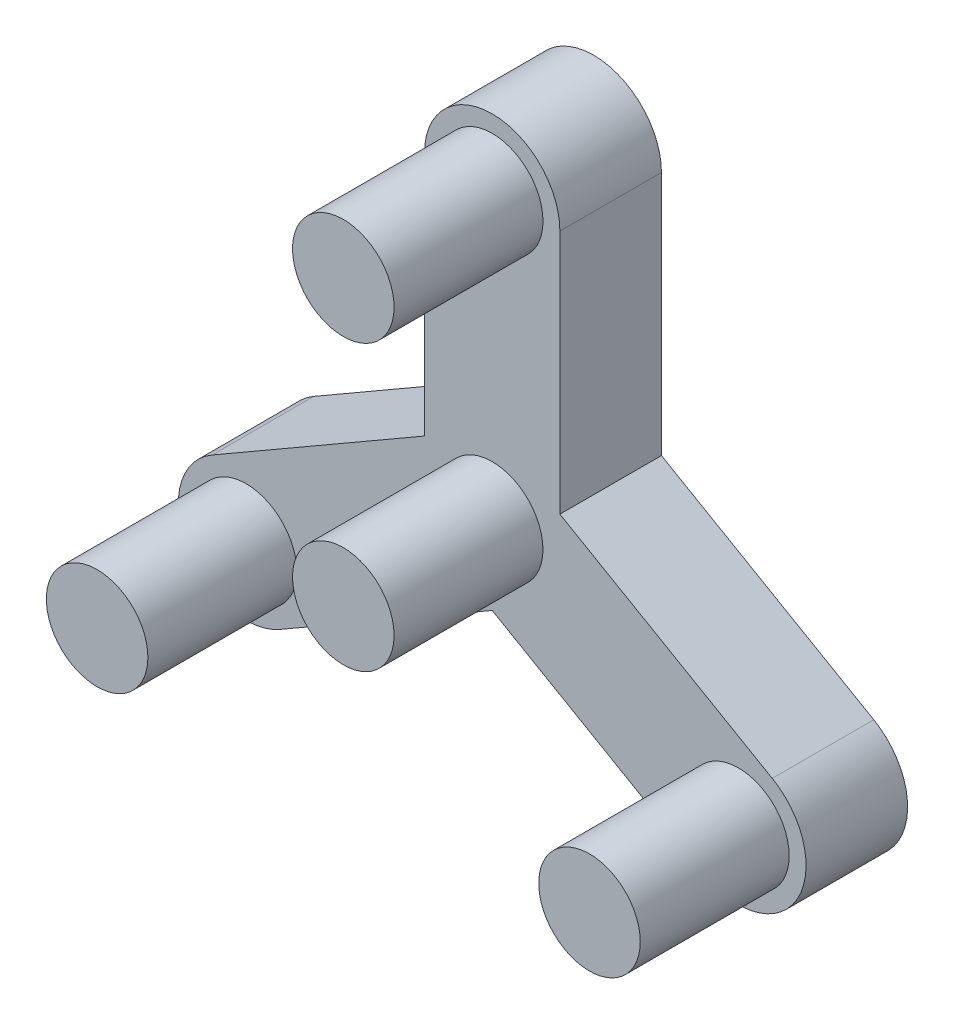
ISO-10303-21;
HEADER;
FILE_DESCRIPTION(('STEP AP214'),'2;1');
FILE_NAME('part.step','',(''),(''),'','','');
FILE_SCHEMA(('AUTOMOTIVE_DESIGN { 1 0 10303 214 1 1 1 1 }'));
ENDSEC;
DATA;
#1=APPLICATION_CONTEXT('core data for automotive mechanical design processes');
#2=APPLICATION_PROTOCOL_DEFINITION('international standard','automotive_design',2000,#1);
#3=PRODUCT_CONTEXT('',#1,'mechanical');
#4=PRODUCT('Part','Part','',(#3));
#5=PRODUCT_RELATED_PRODUCT_CATEGORY('part','',(#4));
#6=PRODUCT_DEFINITION_FORMATION('','',#4);
#7=PRODUCT_DEFINITION_CONTEXT('part definition',#1,'design');
#8=PRODUCT_DEFINITION('design','',#6,#7);
#9=PRODUCT_DEFINITION_SHAPE('','',#8);
#10=(LENGTH_UNIT() NAMED_UNIT(*) SI_UNIT(.MILLI.,.METRE.));
#11=(NAMED_UNIT(*) PLANE_ANGLE_UNIT() SI_UNIT($,.RADIAN.));
#12=(NAMED_UNIT(*) SI_UNIT($,.STERADIAN.) SOLID_ANGLE_UNIT());
#13=UNCERTAINTY_MEASURE_WITH_UNIT(LENGTH_MEASURE(1.E-05),#10,'distance_accuracy_value','');
#14=(GEOMETRIC_REPRESENTATION_CONTEXT(3) GLOBAL_UNCERTAINTY_ASSIGNED_CONTEXT((#13)) GLOBAL_UNIT_ASSIGNED_CONTEXT((#10,
#11,#12)) REPRESENTATION_CONTEXT('',''));
#15=CARTESIAN_POINT('',(0.,0.,0.));
#16=DIRECTION('',(0.,0.,1.));
#17=DIRECTION('',(1.,0.,0.));
#18=AXIS2_PLACEMENT_3D('',#15,#16,#17);
#19=CARTESIAN_POINT('',(-10.,5.77350269189626,7.5));
#20=DIRECTION('',(0.5,-0.866025403784439,0.));
#21=DIRECTION('',(0.866025403784439,0.5,0.));
#22=AXIS2_PLACEMENT_3D('',#19,#20,#21);
#23=PLANE('',#22);
#24=DIRECTION('',(-0.866025403784439,-0.5,0.));
#25=VECTOR('',#24,1.);
#26=CARTESIAN_POINT('',(-10.,5.77350269189626,-7.5));
#27=LINE('',#26,#25);
#28=CARTESIAN_POINT('',(-10.,5.77350269189626,-7.5));
#29=VERTEX_POINT('',#28);
#30=CARTESIAN_POINT('',(-41.3730669605886,-12.3397459631037,-7.5));
#31=VERTEX_POINT('',#30);
#32=EDGE_CURVE('E145',#29,#31,#27,.T.);
#33=ORIENTED_EDGE('',*,*,#32,.T.);
#34=DIRECTION('',(0.,0.,-1.));
#35=VECTOR('',#34,1.);
#36=CARTESIAN_POINT('',(-41.3730669605886,-12.3397459631037,7.5));
#37=LINE('',#36,#35);
#38=CARTESIAN_POINT('',(-41.3730669605886,-12.3397459631037,7.5));
#39=VERTEX_POINT('',#38);
#40=EDGE_CURVE('E45',#39,#31,#37,.T.);
#41=ORIENTED_EDGE('',*,*,#40,.F.);
#42=DIRECTION('',(-0.866025403784439,-0.5,0.));
#43=VECTOR('',#42,1.);
#44=CARTESIAN_POINT('',(-10.,5.77350269189626,7.5));
#45=LINE('',#44,#43);
#46=CARTESIAN_POINT('',(-10.,5.77350269189626,7.5));
#47=VERTEX_POINT('',#46);
#48=EDGE_CURVE('E170',#47,#39,#45,.T.);
#49=ORIENTED_EDGE('',*,*,#48,.F.);
#50=DIRECTION('',(0.,0.,-1.));
#51=VECTOR('',#50,1.);
#52=CARTESIAN_POINT('',(-10.,5.77350269189626,7.5));
#53=LINE('',#52,#51);
#54=EDGE_CURVE('E60',#47,#29,#53,.T.);
#55=ORIENTED_EDGE('',*,*,#54,.T.);
#56=EDGE_LOOP('',(#33,#41,#49,#55));
#57=FACE_BOUND('',#56,.T.);
#58=ADVANCED_FACE('F39',(#57),#23,.F.);
#59=CARTESIAN_POINT('',(-36.3730669589464,-21.,7.5));
#60=DIRECTION('',(0.,0.,-1.));
#61=DIRECTION('',(-1.,0.,0.));
#62=AXIS2_PLACEMENT_3D('',#59,#60,#61);
#63=CYLINDRICAL_SURFACE('',#62,10.);
#64=CARTESIAN_POINT('',(-36.3730669589464,-21.,-7.5));
#65=DIRECTION('',(0.,0.,1.));
#66=DIRECTION('',(1.,0.,0.));
#67=AXIS2_PLACEMENT_3D('',#64,#65,#66);
#68=CIRCLE('',#67,10.);
#69=CARTESIAN_POINT('',(-31.3730669605886,-29.6602540387925,-7.5));
#70=VERTEX_POINT('',#69);
#71=EDGE_CURVE('E148',#31,#70,#68,.T.);
#72=ORIENTED_EDGE('',*,*,#71,.T.);
#73=DIRECTION('',(0.,0.,-1.));
#74=VECTOR('',#73,1.);
#75=CARTESIAN_POINT('',(-31.3730669605886,-29.6602540387925,7.5));
#76=LINE('',#75,#74);
#77=CARTESIAN_POINT('',(-31.3730669605886,-29.6602540387925,7.5));
#78=VERTEX_POINT('',#77);
#79=EDGE_CURVE('E180',#78,#70,#76,.T.);
#80=ORIENTED_EDGE('',*,*,#79,.F.);
#81=CARTESIAN_POINT('',(-36.3730669589464,-21.,7.5));
#82=DIRECTION('',(0.,0.,1.));
#83=DIRECTION('',(1.,0.,0.));
#84=AXIS2_PLACEMENT_3D('',#81,#82,#83);
#85=CIRCLE('',#84,10.);
#86=EDGE_CURVE('E99',#39,#78,#85,.T.);
#87=ORIENTED_EDGE('',*,*,#86,.F.);
#88=ORIENTED_EDGE('',*,*,#40,.T.);
#89=EDGE_LOOP('',(#72,#80,#87,#88));
#90=FACE_BOUND('',#89,.T.);
#91=ADVANCED_FACE('F224',(#90),#63,.T.);
#92=CARTESIAN_POINT('',(0.,-11.5470053837925,7.5));
#93=DIRECTION('',(0.5,-0.866025403784439,0.));
#94=DIRECTION('',(0.866025403784439,0.5,0.));
#95=AXIS2_PLACEMENT_3D('',#92,#93,#94);
#96=PLANE('',#95);
#97=DIRECTION('',(-0.866025403784439,-0.5,0.));
#98=VECTOR('',#97,1.);
#99=CARTESIAN_POINT('',(0.,-11.5470053837925,-7.5));
#100=LINE('',#99,#98);
#101=CARTESIAN_POINT('',(0.,-11.5470053837925,-7.5));
#102=VERTEX_POINT('',#101);
#103=EDGE_CURVE('E147',#102,#70,#100,.T.);
#104=ORIENTED_EDGE('',*,*,#103,.F.);
#105=DIRECTION('',(0.,0.,-1.));
#106=VECTOR('',#105,1.);
#107=CARTESIAN_POINT('',(0.,-11.5470053837925,7.5));
#108=LINE('',#107,#106);
#109=CARTESIAN_POINT('',(0.,-11.5470053837925,7.5));
#110=VERTEX_POINT('',#109);
#111=EDGE_CURVE('E177',#110,#102,#108,.T.);
#112=ORIENTED_EDGE('',*,*,#111,.F.);
#113=DIRECTION('',(-0.866025403784439,-0.5,0.));
#114=VECTOR('',#113,1.);
#115=CARTESIAN_POINT('',(0.,-11.5470053837925,7.5));
#116=LINE('',#115,#114);
#117=EDGE_CURVE('E196',#110,#78,#116,.T.);
#118=ORIENTED_EDGE('',*,*,#117,.T.);
#119=ORIENTED_EDGE('',*,*,#79,.T.);
#120=EDGE_LOOP('',(#104,#112,#118,#119));
#121=FACE_BOUND('',#120,.T.);
#122=ADVANCED_FACE('F227',(#121),#96,.T.);
#123=CARTESIAN_POINT('',(0.,-11.5470053837925,7.5));
#124=DIRECTION('',(0.5,0.866025403784438,0.));
#125=DIRECTION('',(-0.866025403784439,0.5,0.));
#126=AXIS2_PLACEMENT_3D('',#123,#124,#125);
#127=PLANE('',#126);
#128=DIRECTION('',(0.866025403784438,-0.5,0.));
#129=VECTOR('',#128,1.);
#130=CARTESIAN_POINT('',(0.,-11.5470053837925,-7.5));
#131=LINE('',#130,#129);
#132=CARTESIAN_POINT('',(31.3730669605886,-29.6602540387925,-7.5));
#133=VERTEX_POINT('',#132);
#134=EDGE_CURVE('E153',#102,#133,#131,.T.);
#135=ORIENTED_EDGE('',*,*,#134,.T.);
#136=DIRECTION('',(0.,0.,-1.));
#137=VECTOR('',#136,1.);
#138=CARTESIAN_POINT('',(31.3730669605886,-29.6602540387925,7.5));
#139=LINE('',#138,#137);
#140=CARTESIAN_POINT('',(31.3730669605886,-29.6602540387925,7.5));
#141=VERTEX_POINT('',#140);
#142=EDGE_CURVE('E174',#141,#133,#139,.T.);
#143=ORIENTED_EDGE('',*,*,#142,.F.);
#144=DIRECTION('',(0.866025403784438,-0.5,0.));
#145=VECTOR('',#144,1.);
#146=CARTESIAN_POINT('',(0.,-11.5470053837925,7.5));
#147=LINE('',#146,#145);
#148=EDGE_CURVE('E199',#110,#141,#147,.T.);
#149=ORIENTED_EDGE('',*,*,#148,.F.);
#150=ORIENTED_EDGE('',*,*,#111,.T.);
#151=EDGE_LOOP('',(#135,#143,#149,#150));
#152=FACE_BOUND('',#151,.T.);
#153=ADVANCED_FACE('F233',(#152),#127,.F.);
#154=CARTESIAN_POINT('',(36.3730669589464,-21.,7.5));
#155=DIRECTION('',(0.,0.,-1.));
#156=DIRECTION('',(-1.,0.,0.));
#157=AXIS2_PLACEMENT_3D('',#154,#155,#156);
#158=CYLINDRICAL_SURFACE('',#157,10.);
#159=CARTESIAN_POINT('',(36.3730669589464,-21.,-7.5));
#160=DIRECTION('',(0.,0.,1.));
#161=DIRECTION('',(1.,0.,0.));
#162=AXIS2_PLACEMENT_3D('',#159,#160,#161);
#163=CIRCLE('',#162,10.);
#164=CARTESIAN_POINT('',(41.3730669605886,-12.3397459631037,-7.5));
#165=VERTEX_POINT('',#164);
#166=EDGE_CURVE('E154',#133,#165,#163,.T.);
#167=ORIENTED_EDGE('',*,*,#166,.T.);
#168=DIRECTION('',(0.,0.,-1.));
#169=VECTOR('',#168,1.);
#170=CARTESIAN_POINT('',(41.3730669605886,-12.3397459631037,7.5));
#171=LINE('',#170,#169);
#172=CARTESIAN_POINT('',(41.3730669605886,-12.3397459631037,7.5));
#173=VERTEX_POINT('',#172);
#174=EDGE_CURVE('E171',#173,#165,#171,.T.);
#175=ORIENTED_EDGE('',*,*,#174,.F.);
#176=CARTESIAN_POINT('',(36.3730669589464,-21.,7.5));
#177=DIRECTION('',(0.,0.,1.));
#178=DIRECTION('',(1.,0.,0.));
#179=AXIS2_PLACEMENT_3D('',#176,#177,#178);
#180=CIRCLE('',#179,10.);
#181=EDGE_CURVE('E205',#141,#173,#180,.T.);
#182=ORIENTED_EDGE('',*,*,#181,.F.);
#183=ORIENTED_EDGE('',*,*,#142,.T.);
#184=EDGE_LOOP('',(#167,#175,#182,#183));
#185=FACE_BOUND('',#184,.T.);
#186=ADVANCED_FACE('F237',(#185),#158,.T.);
#187=CARTESIAN_POINT('',(9.99999999999999,5.77350269189626,7.5));
#188=DIRECTION('',(0.5,0.866025403784439,0.));
#189=DIRECTION('',(-0.866025403784439,0.5,0.));
#190=AXIS2_PLACEMENT_3D('',#187,#188,#189);
#191=PLANE('',#190);
#192=DIRECTION('',(0.866025403784438,-0.5,0.));
#193=VECTOR('',#192,1.);
#194=CARTESIAN_POINT('',(9.99999999999999,5.77350269189626,-7.5));
#195=LINE('',#194,#193);
#196=CARTESIAN_POINT('',(9.99999999999999,5.77350269189626,-7.5));
#197=VERTEX_POINT('',#196);
#198=EDGE_CURVE('E158',#197,#165,#195,.T.);
#199=ORIENTED_EDGE('',*,*,#198,.F.);
#200=DIRECTION('',(0.,0.,-1.));
#201=VECTOR('',#200,1.);
#202=CARTESIAN_POINT('',(9.99999999999999,5.77350269189626,7.5));
#203=LINE('',#202,#201);
#204=CARTESIAN_POINT('',(9.99999999999999,5.77350269189626,7.5));
#205=VERTEX_POINT('',#204);
#206=EDGE_CURVE('E137',#205,#197,#203,.T.);
#207=ORIENTED_EDGE('',*,*,#206,.F.);
#208=DIRECTION('',(0.866025403784438,-0.5,0.));
#209=VECTOR('',#208,1.);
#210=CARTESIAN_POINT('',(9.99999999999999,5.77350269189626,7.5));
#211=LINE('',#210,#209);
#212=EDGE_CURVE('E127',#205,#173,#211,.T.);
#213=ORIENTED_EDGE('',*,*,#212,.T.);
#214=ORIENTED_EDGE('',*,*,#174,.T.);
#215=EDGE_LOOP('',(#199,#207,#213,#214));
#216=FACE_BOUND('',#215,.T.);
#217=ADVANCED_FACE('F202',(#216),#191,.T.);
#218=CARTESIAN_POINT('',(9.99999999999999,5.77350269189626,7.5));
#219=DIRECTION('',(-1.,0.,0.));
#220=DIRECTION('',(0.,0.,1.));
#221=AXIS2_PLACEMENT_3D('',#218,#219,#220);
#222=PLANE('',#221);
#223=DIRECTION('',(0.,1.,0.));
#224=VECTOR('',#223,1.);
#225=CARTESIAN_POINT('',(9.99999999999999,5.77350269189626,-7.5));
#226=LINE('',#225,#224);
#227=CARTESIAN_POINT('',(10.,42.0000000018963,-7.5));
#228=VERTEX_POINT('',#227);
#229=EDGE_CURVE('E134',#197,#228,#226,.T.);
#230=ORIENTED_EDGE('',*,*,#229,.T.);
#231=DIRECTION('',(0.,0.,-1.));
#232=VECTOR('',#231,1.);
#233=CARTESIAN_POINT('',(10.,42.0000000018963,7.5));
#234=LINE('',#233,#232);
#235=CARTESIAN_POINT('',(10.,42.0000000018963,7.5));
#236=VERTEX_POINT('',#235);
#237=EDGE_CURVE('E128',#236,#228,#234,.T.);
#238=ORIENTED_EDGE('',*,*,#237,.F.);
#239=DIRECTION('',(0.,1.,0.));
#240=VECTOR('',#239,1.);
#241=CARTESIAN_POINT('',(9.99999999999999,5.77350269189626,7.5));
#242=LINE('',#241,#240);
#243=EDGE_CURVE('E118',#205,#236,#242,.T.);
#244=ORIENTED_EDGE('',*,*,#243,.F.);
#245=ORIENTED_EDGE('',*,*,#206,.T.);
#246=EDGE_LOOP('',(#230,#238,#244,#245));
#247=FACE_BOUND('',#246,.T.);
#248=ADVANCED_FACE('F131',(#247),#222,.F.);
#249=CARTESIAN_POINT('',(0.,42.,7.5));
#250=DIRECTION('',(0.,0.,-1.));
#251=DIRECTION('',(-1.,0.,0.));
#252=AXIS2_PLACEMENT_3D('',#249,#250,#251);
#253=CYLINDRICAL_SURFACE('',#252,10.);
#254=CARTESIAN_POINT('',(0.,42.,-7.5));
#255=DIRECTION('',(0.,0.,1.));
#256=DIRECTION('',(1.,0.,0.));
#257=AXIS2_PLACEMENT_3D('',#254,#255,#256);
#258=CIRCLE('',#257,10.);
#259=CARTESIAN_POINT('',(-10.,42.0000000018963,-7.5));
#260=VERTEX_POINT('',#259);
#261=EDGE_CURVE('E165',#228,#260,#258,.T.);
#262=ORIENTED_EDGE('',*,*,#261,.T.);
#263=DIRECTION('',(0.,0.,-1.));
#264=VECTOR('',#263,1.);
#265=CARTESIAN_POINT('',(-10.,42.0000000018963,7.5));
#266=LINE('',#265,#264);
#267=CARTESIAN_POINT('',(-10.,42.0000000018963,7.5));
#268=VERTEX_POINT('',#267);
#269=EDGE_CURVE('E87',#268,#260,#266,.T.);
#270=ORIENTED_EDGE('',*,*,#269,.F.);
#271=CARTESIAN_POINT('',(0.,42.,7.5));
#272=DIRECTION('',(0.,0.,1.));
#273=DIRECTION('',(1.,0.,0.));
#274=AXIS2_PLACEMENT_3D('',#271,#272,#273);
#275=CIRCLE('',#274,10.);
#276=EDGE_CURVE('E124',#236,#268,#275,.T.);
#277=ORIENTED_EDGE('',*,*,#276,.F.);
#278=ORIENTED_EDGE('',*,*,#237,.T.);
#279=EDGE_LOOP('',(#262,#270,#277,#278));
#280=FACE_BOUND('',#279,.T.);
#281=ADVANCED_FACE('F138',(#280),#253,.T.);
#282=CARTESIAN_POINT('',(-10.,5.77350269189626,7.5));
#283=DIRECTION('',(-1.,0.,0.));
#284=DIRECTION('',(0.,-1.,0.));
#285=AXIS2_PLACEMENT_3D('',#282,#283,#284);
#286=PLANE('',#285);
#287=DIRECTION('',(0.,1.,0.));
#288=VECTOR('',#287,1.);
#289=CARTESIAN_POINT('',(-10.,5.77350269189626,-7.5));
#290=LINE('',#289,#288);
#291=EDGE_CURVE('E163',#29,#260,#290,.T.);
#292=ORIENTED_EDGE('',*,*,#291,.F.);
#293=ORIENTED_EDGE('',*,*,#54,.F.);
#294=DIRECTION('',(0.,1.,0.));
#295=VECTOR('',#294,1.);
#296=CARTESIAN_POINT('',(-10.,5.77350269189626,7.5));
#297=LINE('',#296,#295);
#298=EDGE_CURVE('E139',#47,#268,#297,.T.);
#299=ORIENTED_EDGE('',*,*,#298,.T.);
#300=ORIENTED_EDGE('',*,*,#269,.T.);
#301=EDGE_LOOP('',(#292,#293,#299,#300));
#302=FACE_BOUND('',#301,.T.);
#303=ADVANCED_FACE('F209',(#302),#286,.T.);
#304=CARTESIAN_POINT('',(-36.3730669589464,-21.,7.5));
#305=DIRECTION('',(0.,0.,1.));
#306=DIRECTION('',(1.,0.,0.));
#307=AXIS2_PLACEMENT_3D('',#304,#305,#306);
#308=PLANE('',#307);
#309=CARTESIAN_POINT('',(0.,0.,7.5));
#310=DIRECTION('',(0.,0.,1.));
#311=DIRECTION('',(1.,0.,0.));
#312=AXIS2_PLACEMENT_3D('',#309,#310,#311);
#313=CIRCLE('',#312,7.5);
#314=CARTESIAN_POINT('',(7.5,0.,7.5));
#315=VERTEX_POINT('',#314);
#316=EDGE_CURVE('E385',#315,#315,#313,.T.);
#317=ORIENTED_EDGE('',*,*,#316,.F.);
#318=EDGE_LOOP('',(#317));
#319=FACE_BOUND('',#318,.T.);
#320=CARTESIAN_POINT('',(0.,42.,7.5));
#321=DIRECTION('',(0.,0.,1.));
#322=DIRECTION('',(1.,0.,0.));
#323=AXIS2_PLACEMENT_3D('',#320,#321,#322);
#324=CIRCLE('',#323,7.5);
#325=CARTESIAN_POINT('',(7.5,42.,7.5));
#326=VERTEX_POINT('',#325);
#327=EDGE_CURVE('E11',#326,#326,#324,.T.);
#328=ORIENTED_EDGE('',*,*,#327,.F.);
#329=EDGE_LOOP('',(#328));
#330=FACE_BOUND('',#329,.T.);
#331=CARTESIAN_POINT('',(36.3730669589464,-21.,7.5));
#332=DIRECTION('',(0.,0.,1.));
#333=DIRECTION('',(1.,0.,0.));
#334=AXIS2_PLACEMENT_3D('',#331,#332,#333);
#335=CIRCLE('',#334,7.5);
#336=CARTESIAN_POINT('',(43.8730669589464,-21.,7.5));
#337=VERTEX_POINT('',#336);
#338=EDGE_CURVE('E48',#337,#337,#335,.T.);
#339=ORIENTED_EDGE('',*,*,#338,.F.);
#340=EDGE_LOOP('',(#339));
#341=FACE_BOUND('',#340,.T.);
#342=CARTESIAN_POINT('',(-36.3730669589464,-21.,7.5));
#343=DIRECTION('',(0.,0.,1.));
#344=DIRECTION('',(1.,0.,0.));
#345=AXIS2_PLACEMENT_3D('',#342,#343,#344);
#346=CIRCLE('',#345,7.5);
#347=CARTESIAN_POINT('',(-28.8730669589464,-21.,7.5));
#348=VERTEX_POINT('',#347);
#349=EDGE_CURVE('E182',#348,#348,#346,.T.);
#350=ORIENTED_EDGE('',*,*,#349,.F.);
#351=EDGE_LOOP('',(#350));
#352=FACE_BOUND('',#351,.T.);
#353=ORIENTED_EDGE('',*,*,#48,.T.);
#354=ORIENTED_EDGE('',*,*,#86,.T.);
#355=ORIENTED_EDGE('',*,*,#117,.F.);
#356=ORIENTED_EDGE('',*,*,#148,.T.);
#357=ORIENTED_EDGE('',*,*,#181,.T.);
#358=ORIENTED_EDGE('',*,*,#212,.F.);
#359=ORIENTED_EDGE('',*,*,#243,.T.);
#360=ORIENTED_EDGE('',*,*,#276,.T.);
#361=ORIENTED_EDGE('',*,*,#298,.F.);
#362=EDGE_LOOP('',(#353,#354,#355,#356,#357,#358,#359,#360,#361));
#363=FACE_BOUND('',#362,.T.);
#364=ADVANCED_FACE('F122',(#319,#330,#341,#352,#363),#308,.T.);
#365=CARTESIAN_POINT('',(-36.3730669589464,-21.,-7.5));
#366=DIRECTION('',(0.,0.,1.));
#367=DIRECTION('',(1.,0.,0.));
#368=AXIS2_PLACEMENT_3D('',#365,#366,#367);
#369=PLANE('',#368);
#370=ORIENTED_EDGE('',*,*,#32,.F.);
#371=ORIENTED_EDGE('',*,*,#291,.T.);
#372=ORIENTED_EDGE('',*,*,#261,.F.);
#373=ORIENTED_EDGE('',*,*,#229,.F.);
#374=ORIENTED_EDGE('',*,*,#198,.T.);
#375=ORIENTED_EDGE('',*,*,#166,.F.);
#376=ORIENTED_EDGE('',*,*,#134,.F.);
#377=ORIENTED_EDGE('',*,*,#103,.T.);
#378=ORIENTED_EDGE('',*,*,#71,.F.);
#379=EDGE_LOOP('',(#370,#371,#372,#373,#374,#375,#376,#377,#378));
#380=FACE_BOUND('',#379,.T.);
#381=ADVANCED_FACE('F208',(#380),#369,.F.);
#382=CARTESIAN_POINT('',(-36.3730669589464,-21.,29.5));
#383=DIRECTION('',(0.,0.,-1.));
#384=DIRECTION('',(-1.,0.,0.));
#385=AXIS2_PLACEMENT_3D('',#382,#383,#384);
#386=CYLINDRICAL_SURFACE('',#385,7.5);
#387=CARTESIAN_POINT('',(-36.3730669589464,-21.,29.5));
#388=DIRECTION('',(0.,0.,1.));
#389=DIRECTION('',(1.,0.,0.));
#390=AXIS2_PLACEMENT_3D('',#387,#388,#389);
#391=CIRCLE('',#390,7.5);
#392=CARTESIAN_POINT('',(-28.8730669589464,-21.,29.5));
#393=VERTEX_POINT('',#392);
#394=EDGE_CURVE('E195',#393,#393,#391,.T.);
#395=ORIENTED_EDGE('',*,*,#394,.F.);
#396=EDGE_LOOP('',(#395));
#397=FACE_BOUND('',#396,.T.);
#398=ORIENTED_EDGE('',*,*,#349,.T.);
#399=EDGE_LOOP('',(#398));
#400=FACE_BOUND('',#399,.T.);
#401=ADVANCED_FACE('F302',(#397,#400),#386,.T.);
#402=CARTESIAN_POINT('',(-36.3730669589464,-21.,29.5));
#403=DIRECTION('',(0.,0.,1.));
#404=DIRECTION('',(1.,0.,0.));
#405=AXIS2_PLACEMENT_3D('',#402,#403,#404);
#406=PLANE('',#405);
#407=ORIENTED_EDGE('',*,*,#394,.T.);
#408=EDGE_LOOP('',(#407));
#409=FACE_BOUND('',#408,.T.);
#410=ADVANCED_FACE('F310',(#409),#406,.T.);
#411=CARTESIAN_POINT('',(36.3730669589464,-21.,29.5));
#412=DIRECTION('',(0.,0.,-1.));
#413=DIRECTION('',(-1.,0.,0.));
#414=AXIS2_PLACEMENT_3D('',#411,#412,#413);
#415=CYLINDRICAL_SURFACE('',#414,7.5);
#416=CARTESIAN_POINT('',(36.3730669589464,-21.,29.5));
#417=DIRECTION('',(0.,0.,1.));
#418=DIRECTION('',(1.,0.,0.));
#419=AXIS2_PLACEMENT_3D('',#416,#417,#418);
#420=CIRCLE('',#419,7.5);
#421=CARTESIAN_POINT('',(43.8730669589464,-21.,29.5));
#422=VERTEX_POINT('',#421);
#423=EDGE_CURVE('E192',#422,#422,#420,.T.);
#424=ORIENTED_EDGE('',*,*,#423,.F.);
#425=EDGE_LOOP('',(#424));
#426=FACE_BOUND('',#425,.T.);
#427=ORIENTED_EDGE('',*,*,#338,.T.);
#428=EDGE_LOOP('',(#427));
#429=FACE_BOUND('',#428,.T.);
#430=ADVANCED_FACE('F317',(#426,#429),#415,.T.);
#431=CARTESIAN_POINT('',(36.3730669589464,-21.,29.5));
#432=DIRECTION('',(0.,0.,1.));
#433=DIRECTION('',(1.,0.,0.));
#434=AXIS2_PLACEMENT_3D('',#431,#432,#433);
#435=PLANE('',#434);
#436=ORIENTED_EDGE('',*,*,#423,.T.);
#437=EDGE_LOOP('',(#436));
#438=FACE_BOUND('',#437,.T.);
#439=ADVANCED_FACE('F328',(#438),#435,.T.);
#440=CARTESIAN_POINT('',(0.,42.,29.5));
#441=DIRECTION('',(0.,0.,-1.));
#442=DIRECTION('',(-1.,0.,0.));
#443=AXIS2_PLACEMENT_3D('',#440,#441,#442);
#444=CYLINDRICAL_SURFACE('',#443,7.5);
#445=CARTESIAN_POINT('',(0.,42.,29.5));
#446=DIRECTION('',(0.,0.,1.));
#447=DIRECTION('',(1.,0.,0.));
#448=AXIS2_PLACEMENT_3D('',#445,#446,#447);
#449=CIRCLE('',#448,7.5);
#450=CARTESIAN_POINT('',(7.5,42.,29.5));
#451=VERTEX_POINT('',#450);
#452=EDGE_CURVE('E150',#451,#451,#449,.T.);
#453=ORIENTED_EDGE('',*,*,#452,.F.);
#454=EDGE_LOOP('',(#453));
#455=FACE_BOUND('',#454,.T.);
#456=ORIENTED_EDGE('',*,*,#327,.T.);
#457=EDGE_LOOP('',(#456));
#458=FACE_BOUND('',#457,.T.);
#459=ADVANCED_FACE('F338',(#455,#458),#444,.T.);
#460=CARTESIAN_POINT('',(0.,42.,29.5));
#461=DIRECTION('',(0.,0.,1.));
#462=DIRECTION('',(1.,0.,0.));
#463=AXIS2_PLACEMENT_3D('',#460,#461,#462);
#464=PLANE('',#463);
#465=ORIENTED_EDGE('',*,*,#452,.T.);
#466=EDGE_LOOP('',(#465));
#467=FACE_BOUND('',#466,.T.);
#468=ADVANCED_FACE('F349',(#467),#464,.T.);
#469=CARTESIAN_POINT('',(0.,0.,29.5));
#470=DIRECTION('',(0.,0.,-1.));
#471=DIRECTION('',(-1.,0.,0.));
#472=AXIS2_PLACEMENT_3D('',#469,#470,#471);
#473=CYLINDRICAL_SURFACE('',#472,7.5);
#474=CARTESIAN_POINT('',(0.,0.,29.5));
#475=DIRECTION('',(0.,0.,1.));
#476=DIRECTION('',(1.,0.,0.));
#477=AXIS2_PLACEMENT_3D('',#474,#475,#476);
#478=CIRCLE('',#477,7.5);
#479=CARTESIAN_POINT('',(7.5,0.,29.5));
#480=VERTEX_POINT('',#479);
#481=EDGE_CURVE('E191',#480,#480,#478,.T.);
#482=ORIENTED_EDGE('',*,*,#481,.F.);
#483=EDGE_LOOP('',(#482));
#484=FACE_BOUND('',#483,.T.);
#485=ORIENTED_EDGE('',*,*,#316,.T.);
#486=EDGE_LOOP('',(#485));
#487=FACE_BOUND('',#486,.T.);
#488=ADVANCED_FACE('F358',(#484,#487),#473,.T.);
#489=CARTESIAN_POINT('',(0.,0.,29.5));
#490=DIRECTION('',(0.,0.,1.));
#491=DIRECTION('',(1.,0.,0.));
#492=AXIS2_PLACEMENT_3D('',#489,#490,#491);
#493=PLANE('',#492);
#494=ORIENTED_EDGE('',*,*,#481,.T.);
#495=EDGE_LOOP('',(#494));
#496=FACE_BOUND('',#495,.T.);
#497=ADVANCED_FACE('F370',(#496),#493,.T.);
#498=CLOSED_SHELL('',(#58,#91,#122,#153,#186,#217,#248,#281,#303,#364,#381,#401,#410,#430,#439,
#459,#468,#488,#497));
#499=MANIFOLD_SOLID_BREP('B2',#498);
#500=ADVANCED_BREP_SHAPE_REPRESENTATION('',(#18,#499),#14);
#501=SHAPE_DEFINITION_REPRESENTATION(#9,#500);
ENDSEC;
END-ISO-10303-21;
